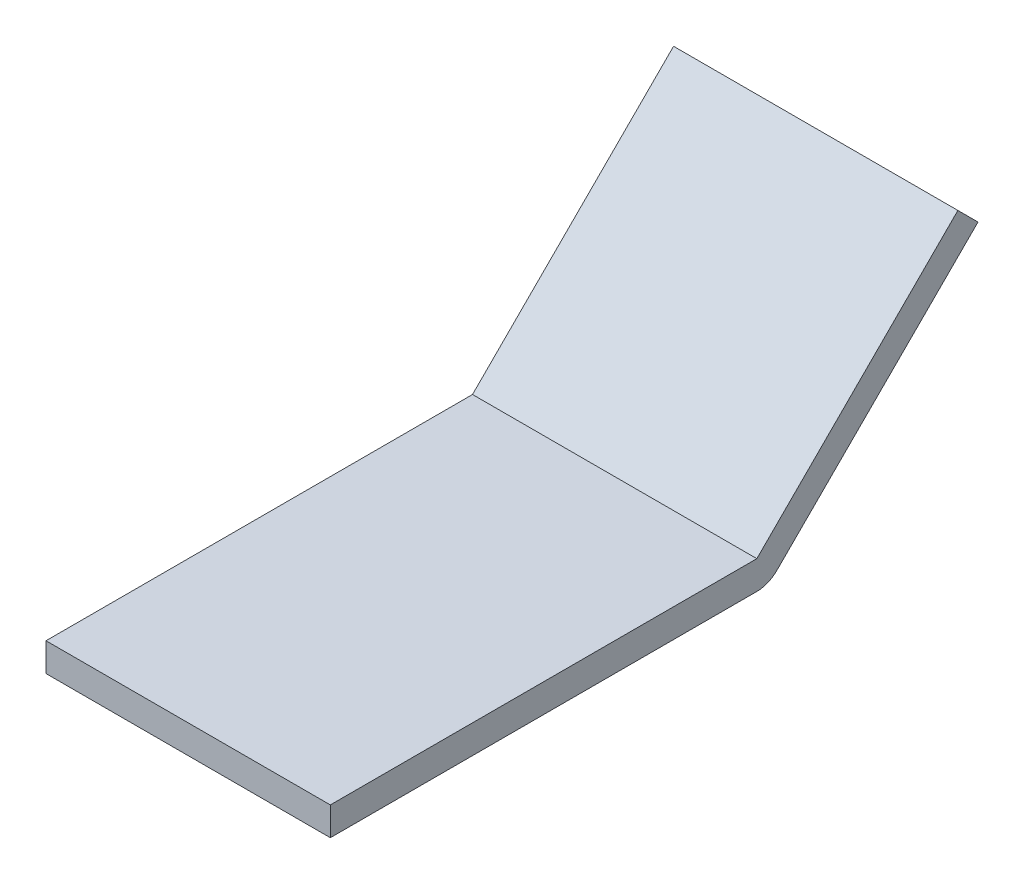
ISO-10303-21;
HEADER;
FILE_DESCRIPTION(('STEP AP214'),'2;1');
FILE_NAME('part.step','',(''),(''),'','','');
FILE_SCHEMA(('AUTOMOTIVE_DESIGN { 1 0 10303 214 1 1 1 1 }'));
ENDSEC;
DATA;
#1=APPLICATION_CONTEXT('core data for automotive mechanical design processes');
#2=APPLICATION_PROTOCOL_DEFINITION('international standard','automotive_design',2000,#1);
#3=PRODUCT_CONTEXT('',#1,'mechanical');
#4=PRODUCT('Part','Part','',(#3));
#5=PRODUCT_RELATED_PRODUCT_CATEGORY('part','',(#4));
#6=PRODUCT_DEFINITION_FORMATION('','',#4);
#7=PRODUCT_DEFINITION_CONTEXT('part definition',#1,'design');
#8=PRODUCT_DEFINITION('design','',#6,#7);
#9=PRODUCT_DEFINITION_SHAPE('','',#8);
#10=(LENGTH_UNIT() NAMED_UNIT(*) SI_UNIT(.MILLI.,.METRE.));
#11=(NAMED_UNIT(*) PLANE_ANGLE_UNIT() SI_UNIT($,.RADIAN.));
#12=(NAMED_UNIT(*) SI_UNIT($,.STERADIAN.) SOLID_ANGLE_UNIT());
#13=UNCERTAINTY_MEASURE_WITH_UNIT(LENGTH_MEASURE(1.E-05),#10,'distance_accuracy_value','');
#14=(GEOMETRIC_REPRESENTATION_CONTEXT(3) GLOBAL_UNCERTAINTY_ASSIGNED_CONTEXT((#13)) GLOBAL_UNIT_ASSIGNED_CONTEXT((#10,
#11,#12)) REPRESENTATION_CONTEXT('',''));
#15=CARTESIAN_POINT('',(0.,0.,0.));
#16=DIRECTION('',(0.,0.,1.));
#17=DIRECTION('',(1.,0.,0.));
#18=AXIS2_PLACEMENT_3D('',#15,#16,#17);
#19=CARTESIAN_POINT('',(120.,2.08166817117217E-13,-2.22044604925031E-13));
#20=DIRECTION('',(0.,0.,-1.));
#21=DIRECTION('',(-1.,0.,0.));
#22=AXIS2_PLACEMENT_3D('',#19,#20,#21);
#23=PLANE('',#22);
#24=DIRECTION('',(0.,-1.,0.));
#25=VECTOR('',#24,1.);
#26=CARTESIAN_POINT('',(0.,0.,0.));
#27=LINE('',#26,#25);
#28=CARTESIAN_POINT('',(0.,0.,0.));
#29=VERTEX_POINT('',#28);
#30=CARTESIAN_POINT('',(0.,-12.0000000000003,0.));
#31=VERTEX_POINT('',#30);
#32=EDGE_CURVE('E96',#29,#31,#27,.T.);
#33=ORIENTED_EDGE('',*,*,#32,.T.);
#34=DIRECTION('',(-1.,0.,0.));
#35=VECTOR('',#34,1.);
#36=CARTESIAN_POINT('',(120.,-12.0000000000001,2.22044604925031E-13));
#37=LINE('',#36,#35);
#38=CARTESIAN_POINT('',(120.,-12.0000000000001,2.22044604925031E-13));
#39=VERTEX_POINT('',#38);
#40=EDGE_CURVE('E11',#39,#31,#37,.T.);
#41=ORIENTED_EDGE('',*,*,#40,.F.);
#42=DIRECTION('',(0.,-1.,0.));
#43=VECTOR('',#42,1.);
#44=CARTESIAN_POINT('',(120.,2.08166817117217E-13,-2.22044604925031E-13));
#45=LINE('',#44,#43);
#46=CARTESIAN_POINT('',(120.,2.08166817117217E-13,-2.22044604925031E-13));
#47=VERTEX_POINT('',#46);
#48=EDGE_CURVE('E121',#47,#39,#45,.T.);
#49=ORIENTED_EDGE('',*,*,#48,.F.);
#50=DIRECTION('',(-1.,0.,0.));
#51=VECTOR('',#50,1.);
#52=CARTESIAN_POINT('',(120.,2.08166817117217E-13,-2.22044604925031E-13));
#53=LINE('',#52,#51);
#54=EDGE_CURVE('E109',#47,#29,#53,.T.);
#55=ORIENTED_EDGE('',*,*,#54,.T.);
#56=EDGE_LOOP('',(#33,#41,#49,#55));
#57=FACE_BOUND('',#56,.T.);
#58=ADVANCED_FACE('F34',(#57),#23,.F.);
#59=CARTESIAN_POINT('',(120.,-12.0000000000001,2.22044604925031E-13));
#60=DIRECTION('',(0.,1.,0.));
#61=DIRECTION('',(0.,0.,1.));
#62=AXIS2_PLACEMENT_3D('',#59,#60,#61);
#63=PLANE('',#62);
#64=DIRECTION('',(0.,0.,-1.));
#65=VECTOR('',#64,1.);
#66=CARTESIAN_POINT('',(0.,-12.0000000000003,0.));
#67=LINE('',#66,#65);
#68=CARTESIAN_POINT('',(0.,-11.9999999999995,-180.));
#69=VERTEX_POINT('',#68);
#70=EDGE_CURVE('E92',#31,#69,#67,.T.);
#71=ORIENTED_EDGE('',*,*,#70,.T.);
#72=DIRECTION('',(-1.,0.,0.));
#73=VECTOR('',#72,1.);
#74=CARTESIAN_POINT('',(120.,-11.9999999999995,-180.));
#75=LINE('',#74,#73);
#76=CARTESIAN_POINT('',(120.,-11.9999999999995,-180.));
#77=VERTEX_POINT('',#76);
#78=EDGE_CURVE('E41',#77,#69,#75,.T.);
#79=ORIENTED_EDGE('',*,*,#78,.F.);
#80=DIRECTION('',(0.,0.,-1.));
#81=VECTOR('',#80,1.);
#82=CARTESIAN_POINT('',(120.,-12.0000000000001,2.22044604925031E-13));
#83=LINE('',#82,#81);
#84=EDGE_CURVE('E105',#39,#77,#83,.T.);
#85=ORIENTED_EDGE('',*,*,#84,.F.);
#86=ORIENTED_EDGE('',*,*,#40,.T.);
#87=EDGE_LOOP('',(#71,#79,#85,#86));
#88=FACE_BOUND('',#87,.T.);
#89=ADVANCED_FACE('F104',(#88),#63,.F.);
#90=CARTESIAN_POINT('',(120.,2.63677968348475E-13,-179.999999999999));
#91=DIRECTION('',(-1.,0.,0.));
#92=DIRECTION('',(0.,0.,1.));
#93=AXIS2_PLACEMENT_3D('',#90,#91,#92);
#94=CYLINDRICAL_SURFACE('',#93,12.);
#95=CARTESIAN_POINT('',(0.,3.33066907387547E-13,-179.999999999999));
#96=DIRECTION('',(1.,0.,0.));
#97=DIRECTION('',(0.,0.,-1.));
#98=AXIS2_PLACEMENT_3D('',#95,#96,#97);
#99=CIRCLE('',#98,12.);
#100=CARTESIAN_POINT('',(0.,-8.48528137423826,-188.485281374238));
#101=VERTEX_POINT('',#100);
#102=EDGE_CURVE('E98',#69,#101,#99,.T.);
#103=ORIENTED_EDGE('',*,*,#102,.T.);
#104=DIRECTION('',(-1.,0.,0.));
#105=VECTOR('',#104,1.);
#106=CARTESIAN_POINT('',(120.,-8.48528137423822,-188.485281374238));
#107=LINE('',#106,#105);
#108=CARTESIAN_POINT('',(120.,-8.48528137423822,-188.485281374238));
#109=VERTEX_POINT('',#108);
#110=EDGE_CURVE('E142',#109,#101,#107,.T.);
#111=ORIENTED_EDGE('',*,*,#110,.F.);
#112=CARTESIAN_POINT('',(120.,2.63677968348475E-13,-179.999999999999));
#113=DIRECTION('',(1.,0.,0.));
#114=DIRECTION('',(0.,0.,-1.));
#115=AXIS2_PLACEMENT_3D('',#112,#113,#114);
#116=CIRCLE('',#115,12.);
#117=EDGE_CURVE('E124',#77,#109,#116,.T.);
#118=ORIENTED_EDGE('',*,*,#117,.F.);
#119=ORIENTED_EDGE('',*,*,#78,.T.);
#120=EDGE_LOOP('',(#103,#111,#118,#119));
#121=FACE_BOUND('',#120,.T.);
#122=ADVANCED_FACE('F146',(#121),#94,.T.);
#123=CARTESIAN_POINT('',(120.,-8.48528137423822,-188.485281374238));
#124=DIRECTION('',(0.,0.707106781186547,0.707106781186548));
#125=DIRECTION('',(0.,-0.707106781186549,0.707106781186546));
#126=AXIS2_PLACEMENT_3D('',#123,#124,#125);
#127=PLANE('',#126);
#128=DIRECTION('',(0.,0.70710678118655,-0.707106781186545));
#129=VECTOR('',#128,1.);
#130=CARTESIAN_POINT('',(0.,-8.48528137423826,-188.485281374238));
#131=LINE('',#130,#129);
#132=CARTESIAN_POINT('',(-1.77635683940025E-12,76.3675323681479,-273.338095116624));
#133=VERTEX_POINT('',#132);
#134=EDGE_CURVE('E113',#101,#133,#131,.T.);
#135=ORIENTED_EDGE('',*,*,#134,.T.);
#136=DIRECTION('',(-1.,0.,0.));
#137=VECTOR('',#136,1.);
#138=CARTESIAN_POINT('',(119.999999999998,76.3675323681476,-273.338095116624));
#139=LINE('',#138,#137);
#140=CARTESIAN_POINT('',(119.999999999998,76.3675323681476,-273.338095116624));
#141=VERTEX_POINT('',#140);
#142=EDGE_CURVE('E139',#141,#133,#139,.T.);
#143=ORIENTED_EDGE('',*,*,#142,.F.);
#144=DIRECTION('',(0.,0.70710678118655,-0.707106781186545));
#145=VECTOR('',#144,1.);
#146=CARTESIAN_POINT('',(120.,-8.48528137423822,-188.485281374238));
#147=LINE('',#146,#145);
#148=EDGE_CURVE('E126',#109,#141,#147,.T.);
#149=ORIENTED_EDGE('',*,*,#148,.F.);
#150=ORIENTED_EDGE('',*,*,#110,.T.);
#151=EDGE_LOOP('',(#135,#143,#149,#150));
#152=FACE_BOUND('',#151,.T.);
#153=ADVANCED_FACE('F154',(#152),#127,.F.);
#154=CARTESIAN_POINT('',(119.999999999998,84.8528137423862,-264.852813742385));
#155=DIRECTION('',(0.,-0.70710678118655,0.707106781186545));
#156=DIRECTION('',(0.,-0.707106781186546,-0.707106781186549));
#157=AXIS2_PLACEMENT_3D('',#154,#155,#156);
#158=PLANE('',#157);
#159=DIRECTION('',(0.,0.707106781186546,0.707106781186549));
#160=VECTOR('',#159,1.);
#161=CARTESIAN_POINT('',(-1.77635683940025E-12,84.852813742386,-264.852813742385));
#162=LINE('',#161,#160);
#163=CARTESIAN_POINT('',(-1.77635683940025E-12,84.852813742386,-264.852813742385));
#164=VERTEX_POINT('',#163);
#165=EDGE_CURVE('E115',#133,#164,#162,.T.);
#166=ORIENTED_EDGE('',*,*,#165,.T.);
#167=DIRECTION('',(-1.,0.,0.));
#168=VECTOR('',#167,1.);
#169=CARTESIAN_POINT('',(119.999999999998,84.8528137423862,-264.852813742385));
#170=LINE('',#169,#168);
#171=CARTESIAN_POINT('',(119.999999999998,84.8528137423862,-264.852813742385));
#172=VERTEX_POINT('',#171);
#173=EDGE_CURVE('E136',#172,#164,#170,.T.);
#174=ORIENTED_EDGE('',*,*,#173,.F.);
#175=DIRECTION('',(0.,0.707106781186546,0.707106781186549));
#176=VECTOR('',#175,1.);
#177=CARTESIAN_POINT('',(119.999999999998,84.8528137423862,-264.852813742385));
#178=LINE('',#177,#176);
#179=EDGE_CURVE('E128',#141,#172,#178,.T.);
#180=ORIENTED_EDGE('',*,*,#179,.F.);
#181=ORIENTED_EDGE('',*,*,#142,.T.);
#182=EDGE_LOOP('',(#166,#174,#180,#181));
#183=FACE_BOUND('',#182,.T.);
#184=ADVANCED_FACE('F157',(#183),#158,.F.);
#185=CARTESIAN_POINT('',(120.,2.63677968348475E-13,-179.999999999999));
#186=DIRECTION('',(0.,-0.707106781186547,-0.707106781186548));
#187=DIRECTION('',(0.,0.707106781186549,-0.707106781186546));
#188=AXIS2_PLACEMENT_3D('',#185,#186,#187);
#189=PLANE('',#188);
#190=DIRECTION('',(0.,-0.707106781186549,0.707106781186546));
#191=VECTOR('',#190,1.);
#192=CARTESIAN_POINT('',(0.,3.33066907387547E-13,-179.999999999999));
#193=LINE('',#192,#191);
#194=CARTESIAN_POINT('',(0.,3.33066907387547E-13,-179.999999999999));
#195=VERTEX_POINT('',#194);
#196=EDGE_CURVE('E117',#164,#195,#193,.T.);
#197=ORIENTED_EDGE('',*,*,#196,.T.);
#198=DIRECTION('',(-1.,0.,0.));
#199=VECTOR('',#198,1.);
#200=CARTESIAN_POINT('',(120.,2.63677968348475E-13,-179.999999999999));
#201=LINE('',#200,#199);
#202=CARTESIAN_POINT('',(120.,2.63677968348475E-13,-179.999999999999));
#203=VERTEX_POINT('',#202);
#204=EDGE_CURVE('E133',#203,#195,#201,.T.);
#205=ORIENTED_EDGE('',*,*,#204,.F.);
#206=DIRECTION('',(0.,-0.707106781186549,0.707106781186546));
#207=VECTOR('',#206,1.);
#208=CARTESIAN_POINT('',(120.,2.63677968348475E-13,-179.999999999999));
#209=LINE('',#208,#207);
#210=EDGE_CURVE('E53',#172,#203,#209,.T.);
#211=ORIENTED_EDGE('',*,*,#210,.F.);
#212=ORIENTED_EDGE('',*,*,#173,.T.);
#213=EDGE_LOOP('',(#197,#205,#211,#212));
#214=FACE_BOUND('',#213,.T.);
#215=ADVANCED_FACE('F160',(#214),#189,.F.);
#216=CARTESIAN_POINT('',(120.,2.08166817117217E-13,-2.22044604925031E-13));
#217=DIRECTION('',(0.,-1.,0.));
#218=DIRECTION('',(0.,0.,-1.));
#219=AXIS2_PLACEMENT_3D('',#216,#217,#218);
#220=PLANE('',#219);
#221=DIRECTION('',(0.,0.,1.));
#222=VECTOR('',#221,1.);
#223=CARTESIAN_POINT('',(0.,0.,0.));
#224=LINE('',#223,#222);
#225=EDGE_CURVE('E119',#195,#29,#224,.T.);
#226=ORIENTED_EDGE('',*,*,#225,.T.);
#227=ORIENTED_EDGE('',*,*,#54,.F.);
#228=DIRECTION('',(0.,0.,1.));
#229=VECTOR('',#228,1.);
#230=CARTESIAN_POINT('',(120.,2.08166817117217E-13,-2.22044604925031E-13));
#231=LINE('',#230,#229);
#232=EDGE_CURVE('E48',#203,#47,#231,.T.);
#233=ORIENTED_EDGE('',*,*,#232,.F.);
#234=ORIENTED_EDGE('',*,*,#204,.T.);
#235=EDGE_LOOP('',(#226,#227,#233,#234));
#236=FACE_BOUND('',#235,.T.);
#237=ADVANCED_FACE('F162',(#236),#220,.F.);
#238=CARTESIAN_POINT('',(120.,2.63677968348475E-13,-179.999999999999));
#239=DIRECTION('',(1.,0.,0.));
#240=DIRECTION('',(0.,0.,-1.));
#241=AXIS2_PLACEMENT_3D('',#238,#239,#240);
#242=PLANE('',#241);
#243=ORIENTED_EDGE('',*,*,#48,.T.);
#244=ORIENTED_EDGE('',*,*,#84,.T.);
#245=ORIENTED_EDGE('',*,*,#117,.T.);
#246=ORIENTED_EDGE('',*,*,#148,.T.);
#247=ORIENTED_EDGE('',*,*,#179,.T.);
#248=ORIENTED_EDGE('',*,*,#210,.T.);
#249=ORIENTED_EDGE('',*,*,#232,.T.);
#250=EDGE_LOOP('',(#243,#244,#245,#246,#247,#248,#249));
#251=FACE_BOUND('',#250,.T.);
#252=ADVANCED_FACE('F149',(#251),#242,.T.);
#253=CARTESIAN_POINT('',(0.,3.33066907387547E-13,-179.999999999999));
#254=DIRECTION('',(1.,0.,0.));
#255=DIRECTION('',(0.,0.,-1.));
#256=AXIS2_PLACEMENT_3D('',#253,#254,#255);
#257=PLANE('',#256);
#258=ORIENTED_EDGE('',*,*,#32,.F.);
#259=ORIENTED_EDGE('',*,*,#225,.F.);
#260=ORIENTED_EDGE('',*,*,#196,.F.);
#261=ORIENTED_EDGE('',*,*,#165,.F.);
#262=ORIENTED_EDGE('',*,*,#134,.F.);
#263=ORIENTED_EDGE('',*,*,#102,.F.);
#264=ORIENTED_EDGE('',*,*,#70,.F.);
#265=EDGE_LOOP('',(#258,#259,#260,#261,#262,#263,#264));
#266=FACE_BOUND('',#265,.T.);
#267=ADVANCED_FACE('F93',(#266),#257,.F.);
#268=CLOSED_SHELL('',(#58,#89,#122,#153,#184,#215,#237,#252,#267));
#269=MANIFOLD_SOLID_BREP('B2',#268);
#270=ADVANCED_BREP_SHAPE_REPRESENTATION('',(#18,#269),#14);
#271=SHAPE_DEFINITION_REPRESENTATION(#9,#270);
ENDSEC;
END-ISO-10303-21;
